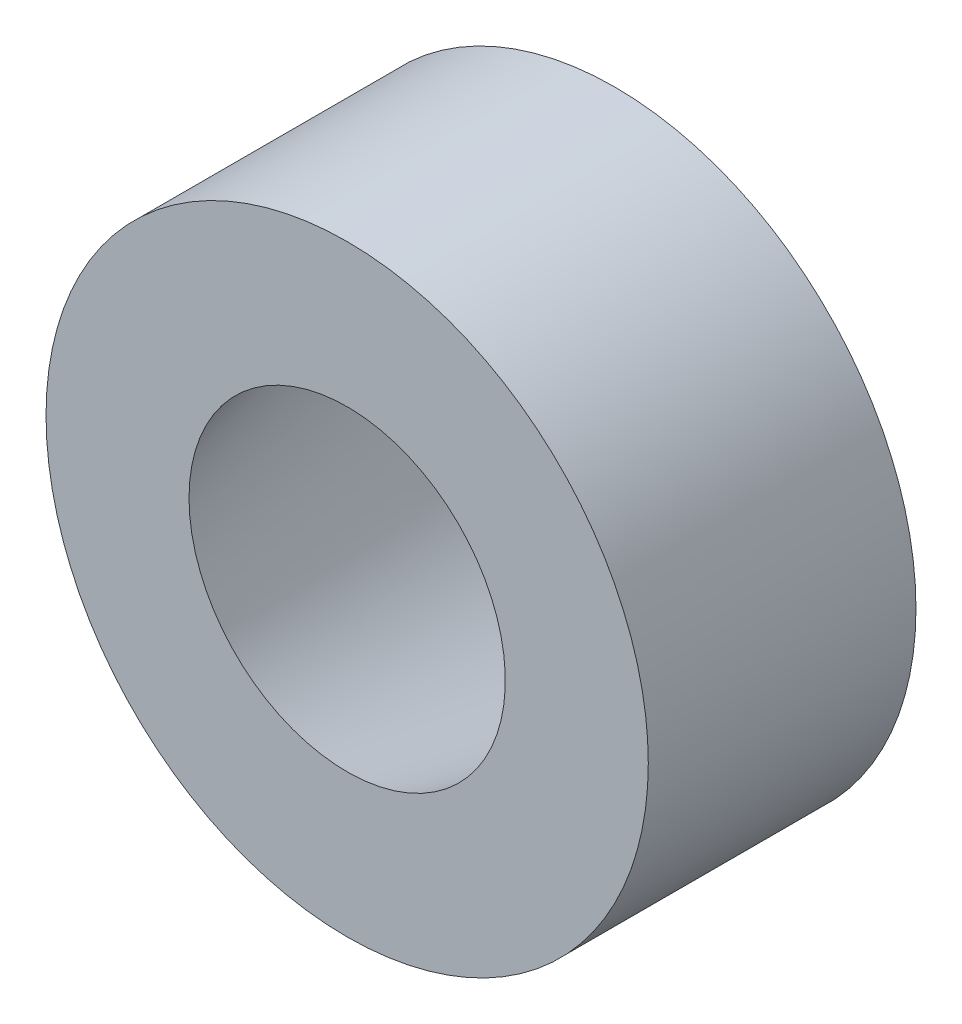
ISO-10303-21;
HEADER;
FILE_DESCRIPTION(('STEP AP214'),'2;1');
FILE_NAME('part.step','',(''),(''),'','','');
FILE_SCHEMA(('AUTOMOTIVE_DESIGN { 1 0 10303 214 1 1 1 1 }'));
ENDSEC;
DATA;
#1=APPLICATION_CONTEXT('core data for automotive mechanical design processes');
#2=APPLICATION_PROTOCOL_DEFINITION('international standard','automotive_design',2000,#1);
#3=PRODUCT_CONTEXT('',#1,'mechanical');
#4=PRODUCT('Part','Part','',(#3));
#5=PRODUCT_RELATED_PRODUCT_CATEGORY('part','',(#4));
#6=PRODUCT_DEFINITION_FORMATION('','',#4);
#7=PRODUCT_DEFINITION_CONTEXT('part definition',#1,'design');
#8=PRODUCT_DEFINITION('design','',#6,#7);
#9=PRODUCT_DEFINITION_SHAPE('','',#8);
#10=(LENGTH_UNIT() NAMED_UNIT(*) SI_UNIT(.MILLI.,.METRE.));
#11=(NAMED_UNIT(*) PLANE_ANGLE_UNIT() SI_UNIT($,.RADIAN.));
#12=(NAMED_UNIT(*) SI_UNIT($,.STERADIAN.) SOLID_ANGLE_UNIT());
#13=UNCERTAINTY_MEASURE_WITH_UNIT(LENGTH_MEASURE(1.E-05),#10,'distance_accuracy_value','');
#14=(GEOMETRIC_REPRESENTATION_CONTEXT(3) GLOBAL_UNCERTAINTY_ASSIGNED_CONTEXT((#13)) GLOBAL_UNIT_ASSIGNED_CONTEXT((#10,
#11,#12)) REPRESENTATION_CONTEXT('',''));
#15=CARTESIAN_POINT('',(0.,0.,0.));
#16=DIRECTION('',(0.,0.,1.));
#17=DIRECTION('',(1.,0.,0.));
#18=AXIS2_PLACEMENT_3D('',#15,#16,#17);
#19=CARTESIAN_POINT('',(0.,0.,8.));
#20=DIRECTION('',(0.,0.,-1.));
#21=DIRECTION('',(-1.,0.,0.));
#22=AXIS2_PLACEMENT_3D('',#19,#20,#21);
#23=CYLINDRICAL_SURFACE('',#22,9.);
#24=CARTESIAN_POINT('',(0.,0.,8.));
#25=DIRECTION('',(0.,0.,1.));
#26=DIRECTION('',(1.,0.,0.));
#27=AXIS2_PLACEMENT_3D('',#24,#25,#26);
#28=CIRCLE('',#27,9.);
#29=CARTESIAN_POINT('',(9.,0.,8.));
#30=VERTEX_POINT('',#29);
#31=EDGE_CURVE('E10',#30,#30,#28,.T.);
#32=ORIENTED_EDGE('',*,*,#31,.F.);
#33=EDGE_LOOP('',(#32));
#34=FACE_BOUND('',#33,.T.);
#35=CARTESIAN_POINT('',(0.,0.,0.));
#36=DIRECTION('',(0.,0.,1.));
#37=DIRECTION('',(1.,0.,0.));
#38=AXIS2_PLACEMENT_3D('',#35,#36,#37);
#39=CIRCLE('',#38,9.);
#40=CARTESIAN_POINT('',(9.,0.,0.));
#41=VERTEX_POINT('',#40);
#42=EDGE_CURVE('E38',#41,#41,#39,.T.);
#43=ORIENTED_EDGE('',*,*,#42,.T.);
#44=EDGE_LOOP('',(#43));
#45=FACE_BOUND('',#44,.T.);
#46=ADVANCED_FACE('F32',(#34,#45),#23,.T.);
#47=CARTESIAN_POINT('',(0.,0.,8.));
#48=DIRECTION('',(0.,0.,1.));
#49=DIRECTION('',(1.,0.,0.));
#50=AXIS2_PLACEMENT_3D('',#47,#48,#49);
#51=PLANE('',#50);
#52=CARTESIAN_POINT('',(0.,0.,8.));
#53=DIRECTION('',(0.,0.,-1.));
#54=DIRECTION('',(-1.,0.,0.));
#55=AXIS2_PLACEMENT_3D('',#52,#53,#54);
#56=CIRCLE('',#55,4.72644269885648);
#57=CARTESIAN_POINT('',(-4.72644269885648,0.,8.));
#58=VERTEX_POINT('',#57);
#59=EDGE_CURVE('E42',#58,#58,#56,.T.);
#60=ORIENTED_EDGE('',*,*,#59,.T.);
#61=EDGE_LOOP('',(#60));
#62=FACE_BOUND('',#61,.T.);
#63=ORIENTED_EDGE('',*,*,#31,.T.);
#64=EDGE_LOOP('',(#63));
#65=FACE_BOUND('',#64,.T.);
#66=ADVANCED_FACE('F57',(#62,#65),#51,.T.);
#67=CARTESIAN_POINT('',(0.,0.,0.));
#68=DIRECTION('',(0.,0.,1.));
#69=DIRECTION('',(1.,0.,0.));
#70=AXIS2_PLACEMENT_3D('',#67,#68,#69);
#71=PLANE('',#70);
#72=CARTESIAN_POINT('',(0.,0.,0.));
#73=DIRECTION('',(0.,0.,-1.));
#74=DIRECTION('',(-1.,0.,0.));
#75=AXIS2_PLACEMENT_3D('',#72,#73,#74);
#76=CIRCLE('',#75,6.5);
#77=CARTESIAN_POINT('',(-6.5,0.,0.));
#78=VERTEX_POINT('',#77);
#79=EDGE_CURVE('E46',#78,#78,#76,.T.);
#80=ORIENTED_EDGE('',*,*,#79,.F.);
#81=EDGE_LOOP('',(#80));
#82=FACE_BOUND('',#81,.T.);
#83=ORIENTED_EDGE('',*,*,#42,.F.);
#84=EDGE_LOOP('',(#83));
#85=FACE_BOUND('',#84,.T.);
#86=ADVANCED_FACE('F54',(#82,#85),#71,.F.);
#87=CARTESIAN_POINT('',(0.,0.,0.));
#88=DIRECTION('',(0.,0.,-1.));
#89=DIRECTION('',(-1.,0.,0.));
#90=AXIS2_PLACEMENT_3D('',#87,#88,#89);
#91=CONICAL_SURFACE('',#90,6.5,0.218166156499292);
#92=ORIENTED_EDGE('',*,*,#59,.F.);
#93=EDGE_LOOP('',(#92));
#94=FACE_BOUND('',#93,.T.);
#95=ORIENTED_EDGE('',*,*,#79,.T.);
#96=EDGE_LOOP('',(#95));
#97=FACE_BOUND('',#96,.T.);
#98=ADVANCED_FACE('F52',(#94,#97),#91,.F.);
#99=CLOSED_SHELL('',(#46,#66,#86,#98));
#100=MANIFOLD_SOLID_BREP('B2',#99);
#101=ADVANCED_BREP_SHAPE_REPRESENTATION('',(#18,#100),#14);
#102=SHAPE_DEFINITION_REPRESENTATION(#9,#101);
ENDSEC;
END-ISO-10303-21;
